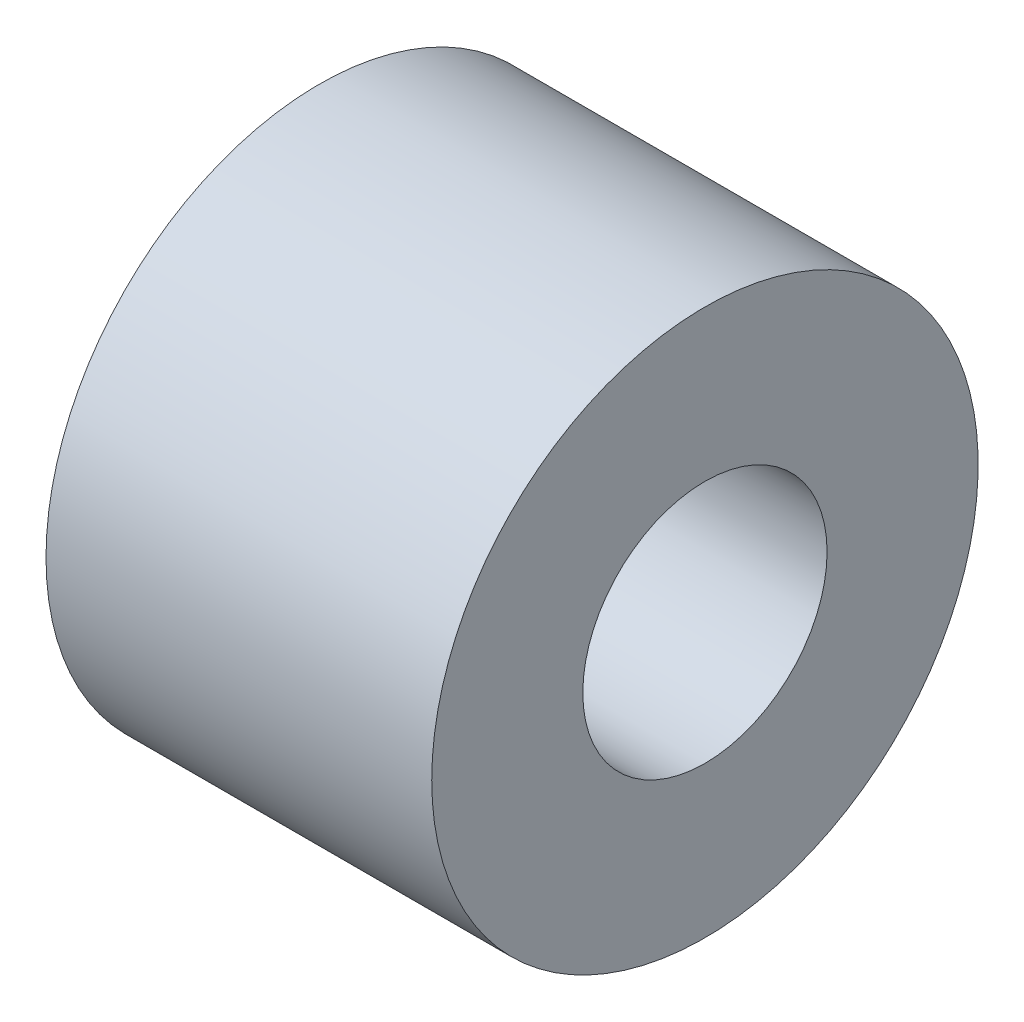
ISO-10303-21;
HEADER;
FILE_DESCRIPTION(('STEP AP214'),'2;1');
FILE_NAME('part.step','',(''),(''),'','','');
FILE_SCHEMA(('AUTOMOTIVE_DESIGN { 1 0 10303 214 1 1 1 1 }'));
ENDSEC;
DATA;
#1=APPLICATION_CONTEXT('core data for automotive mechanical design processes');
#2=APPLICATION_PROTOCOL_DEFINITION('international standard','automotive_design',2000,#1);
#3=PRODUCT_CONTEXT('',#1,'mechanical');
#4=PRODUCT('Part','Part','',(#3));
#5=PRODUCT_RELATED_PRODUCT_CATEGORY('part','',(#4));
#6=PRODUCT_DEFINITION_FORMATION('','',#4);
#7=PRODUCT_DEFINITION_CONTEXT('part definition',#1,'design');
#8=PRODUCT_DEFINITION('design','',#6,#7);
#9=PRODUCT_DEFINITION_SHAPE('','',#8);
#10=(LENGTH_UNIT() NAMED_UNIT(*) SI_UNIT(.MILLI.,.METRE.));
#11=(NAMED_UNIT(*) PLANE_ANGLE_UNIT() SI_UNIT($,.RADIAN.));
#12=(NAMED_UNIT(*) SI_UNIT($,.STERADIAN.) SOLID_ANGLE_UNIT());
#13=UNCERTAINTY_MEASURE_WITH_UNIT(LENGTH_MEASURE(1.E-05),#10,'distance_accuracy_value','');
#14=(GEOMETRIC_REPRESENTATION_CONTEXT(3) GLOBAL_UNCERTAINTY_ASSIGNED_CONTEXT((#13)) GLOBAL_UNIT_ASSIGNED_CONTEXT((#10,
#11,#12)) REPRESENTATION_CONTEXT('',''));
#15=CARTESIAN_POINT('',(0.,0.,0.));
#16=DIRECTION('',(0.,0.,1.));
#17=DIRECTION('',(1.,0.,0.));
#18=AXIS2_PLACEMENT_3D('',#15,#16,#17);
#19=CARTESIAN_POINT('',(3.81,0.,0.));
#20=DIRECTION('',(1.,0.,0.));
#21=DIRECTION('',(0.,0.,-1.00000000000002));
#22=AXIS2_PLACEMENT_3D('',#19,#20,#21);
#23=PLANE('',#22);
#24=CARTESIAN_POINT('',(3.81,0.,0.));
#25=DIRECTION('',(1.,0.,0.));
#26=DIRECTION('',(0.,0.,-1.00000000000002));
#27=AXIS2_PLACEMENT_3D('',#24,#25,#26);
#28=CIRCLE('',#27,5.3975);
#29=CARTESIAN_POINT('',(3.81,0.,5.39750000000009));
#30=VERTEX_POINT('',#29);
#31=EDGE_CURVE('E10',#30,#30,#28,.T.);
#32=ORIENTED_EDGE('',*,*,#31,.T.);
#33=EDGE_LOOP('',(#32));
#34=FACE_BOUND('',#33,.T.);
#35=CARTESIAN_POINT('',(3.81,0.,0.));
#36=DIRECTION('',(1.,0.,0.));
#37=DIRECTION('',(0.,0.,-1.00000000000002));
#38=AXIS2_PLACEMENT_3D('',#35,#36,#37);
#39=CIRCLE('',#38,2.413);
#40=CARTESIAN_POINT('',(3.81,0.,2.41300000000004));
#41=VERTEX_POINT('',#40);
#42=EDGE_CURVE('E43',#41,#41,#39,.T.);
#43=ORIENTED_EDGE('',*,*,#42,.F.);
#44=EDGE_LOOP('',(#43));
#45=FACE_BOUND('',#44,.T.);
#46=ADVANCED_FACE('F32',(#34,#45),#23,.T.);
#47=CARTESIAN_POINT('',(-3.81,0.,0.));
#48=DIRECTION('',(1.,0.,0.));
#49=DIRECTION('',(0.,0.,-1.00000000000002));
#50=AXIS2_PLACEMENT_3D('',#47,#48,#49);
#51=PLANE('',#50);
#52=CARTESIAN_POINT('',(-3.81,0.,0.));
#53=DIRECTION('',(1.,0.,0.));
#54=DIRECTION('',(0.,0.,-1.00000000000002));
#55=AXIS2_PLACEMENT_3D('',#52,#53,#54);
#56=CIRCLE('',#55,5.3975);
#57=CARTESIAN_POINT('',(-3.81,0.,5.39750000000009));
#58=VERTEX_POINT('',#57);
#59=EDGE_CURVE('E36',#58,#58,#56,.T.);
#60=ORIENTED_EDGE('',*,*,#59,.F.);
#61=EDGE_LOOP('',(#60));
#62=FACE_BOUND('',#61,.T.);
#63=CARTESIAN_POINT('',(-3.81,0.,0.));
#64=DIRECTION('',(1.,0.,0.));
#65=DIRECTION('',(0.,0.,-1.00000000000002));
#66=AXIS2_PLACEMENT_3D('',#63,#64,#65);
#67=CIRCLE('',#66,2.413);
#68=CARTESIAN_POINT('',(-3.81,0.,2.41300000000004));
#69=VERTEX_POINT('',#68);
#70=EDGE_CURVE('E45',#69,#69,#67,.T.);
#71=ORIENTED_EDGE('',*,*,#70,.T.);
#72=EDGE_LOOP('',(#71));
#73=FACE_BOUND('',#72,.T.);
#74=ADVANCED_FACE('F55',(#62,#73),#51,.F.);
#75=CARTESIAN_POINT('',(3.81,0.,0.));
#76=DIRECTION('',(-1.,0.,0.));
#77=DIRECTION('',(0.,0.,1.00000000000002));
#78=AXIS2_PLACEMENT_3D('',#75,#76,#77);
#79=CYLINDRICAL_SURFACE('',#78,5.3975);
#80=CARTESIAN_POINT('',(3.81,0.,5.39750000000009));
#81=CARTESIAN_POINT('',(3.730625,0.,5.39750000000009));
#82=CARTESIAN_POINT('',(3.65125,0.,5.39750000000009));
#83=CARTESIAN_POINT('',(3.4925,0.,5.39750000000009));
#84=CARTESIAN_POINT('',(3.413125,0.,5.39750000000009));
#85=CARTESIAN_POINT('',(3.254375,0.,5.39750000000009));
#86=CARTESIAN_POINT('',(3.175,0.,5.39750000000009));
#87=CARTESIAN_POINT('',(3.01625,0.,5.39750000000009));
#88=CARTESIAN_POINT('',(2.936875,0.,5.39750000000009));
#89=CARTESIAN_POINT('',(2.778125,0.,5.39750000000009));
#90=CARTESIAN_POINT('',(2.69875,0.,5.39750000000009));
#91=CARTESIAN_POINT('',(2.54,0.,5.39750000000009));
#92=CARTESIAN_POINT('',(2.460625,0.,5.39750000000009));
#93=CARTESIAN_POINT('',(2.301875,0.,5.39750000000009));
#94=CARTESIAN_POINT('',(2.2225,0.,5.39750000000009));
#95=CARTESIAN_POINT('',(2.06375,0.,5.39750000000009));
#96=CARTESIAN_POINT('',(1.984375,0.,5.39750000000009));
#97=CARTESIAN_POINT('',(1.825625,0.,5.39750000000009));
#98=CARTESIAN_POINT('',(1.74625,0.,5.39750000000009));
#99=CARTESIAN_POINT('',(1.5875,0.,5.39750000000009));
#100=CARTESIAN_POINT('',(1.508125,0.,5.39750000000009));
#101=CARTESIAN_POINT('',(1.349375,0.,5.39750000000009));
#102=CARTESIAN_POINT('',(1.27,0.,5.39750000000009));
#103=CARTESIAN_POINT('',(1.11125,0.,5.39750000000009));
#104=CARTESIAN_POINT('',(1.031875,0.,5.39750000000009));
#105=CARTESIAN_POINT('',(0.873125000000001,0.,5.39750000000009));
#106=CARTESIAN_POINT('',(0.793750000000001,0.,5.39750000000009));
#107=CARTESIAN_POINT('',(0.635000000000001,0.,5.39750000000009));
#108=CARTESIAN_POINT('',(0.555625000000001,0.,5.39750000000009));
#109=CARTESIAN_POINT('',(0.396875000000001,0.,5.39750000000009));
#110=CARTESIAN_POINT('',(0.317500000000001,0.,5.39750000000009));
#111=CARTESIAN_POINT('',(0.15875,0.,5.39750000000009));
#112=CARTESIAN_POINT('',(0.0793750000000002,0.,5.39750000000009));
#113=CARTESIAN_POINT('',(-0.0793749999999999,0.,5.39750000000009));
#114=CARTESIAN_POINT('',(-0.15875,0.,5.39750000000009));
#115=CARTESIAN_POINT('',(-0.3175,0.,5.39750000000009));
#116=CARTESIAN_POINT('',(-0.396875,0.,5.39750000000009));
#117=CARTESIAN_POINT('',(-0.555625,0.,5.39750000000009));
#118=CARTESIAN_POINT('',(-0.635,0.,5.39750000000009));
#119=CARTESIAN_POINT('',(-0.79375,0.,5.39750000000009));
#120=CARTESIAN_POINT('',(-0.873125,0.,5.39750000000009));
#121=CARTESIAN_POINT('',(-1.031875,0.,5.39750000000009));
#122=CARTESIAN_POINT('',(-1.11125,0.,5.39750000000009));
#123=CARTESIAN_POINT('',(-1.27,0.,5.39750000000009));
#124=CARTESIAN_POINT('',(-1.349375,0.,5.39750000000009));
#125=CARTESIAN_POINT('',(-1.508125,0.,5.39750000000009));
#126=CARTESIAN_POINT('',(-1.5875,0.,5.39750000000009));
#127=CARTESIAN_POINT('',(-1.74625,0.,5.39750000000009));
#128=CARTESIAN_POINT('',(-1.825625,0.,5.39750000000009));
#129=CARTESIAN_POINT('',(-1.984375,0.,5.39750000000009));
#130=CARTESIAN_POINT('',(-2.06375,0.,5.39750000000009));
#131=CARTESIAN_POINT('',(-2.2225,0.,5.39750000000009));
#132=CARTESIAN_POINT('',(-2.301875,0.,5.39750000000009));
#133=CARTESIAN_POINT('',(-2.460625,0.,5.39750000000009));
#134=CARTESIAN_POINT('',(-2.54,0.,5.39750000000009));
#135=CARTESIAN_POINT('',(-2.69875,0.,5.39750000000009));
#136=CARTESIAN_POINT('',(-2.778125,0.,5.39750000000009));
#137=CARTESIAN_POINT('',(-2.936875,0.,5.39750000000009));
#138=CARTESIAN_POINT('',(-3.01625,0.,5.39750000000009));
#139=CARTESIAN_POINT('',(-3.175,0.,5.39750000000009));
#140=CARTESIAN_POINT('',(-3.254375,0.,5.39750000000009));
#141=CARTESIAN_POINT('',(-3.413125,0.,5.39750000000009));
#142=CARTESIAN_POINT('',(-3.4925,0.,5.39750000000009));
#143=CARTESIAN_POINT('',(-3.65125,0.,5.39750000000009));
#144=CARTESIAN_POINT('',(-3.730625,0.,5.39750000000009));
#145=CARTESIAN_POINT('',(-3.81,0.,5.39750000000009));
#146=B_SPLINE_CURVE_WITH_KNOTS('',3,(#80,#81,#82,#83,#84,#85,#86,#87,#88,#89,#90,#91,#92,#93,
#94,#95,#96,#97,#98,#99,#100,#101,#102,#103,#104,#105,#106,#107,#108,#109,#110,#111,#112,#113,
#114,#115,#116,#117,#118,#119,#120,#121,#122,#123,#124,#125,#126,#127,#128,#129,#130,#131,#132,
#133,#134,#135,#136,#137,#138,#139,#140,#141,#142,#143,#144,#145),.UNSPECIFIED.,.F.,.F.,(4,2,2,
2,2,2,2,2,2,2,2,2,2,2,2,2,2,2,2,2,2,2,2,2,2,2,2,2,2,2,2,2,4),(0.,0.238125,0.47625,
0.714375000000001,0.952500000000001,1.190625,1.42875,1.666875,1.905,2.143125,2.38125,2.619375,
2.8575,3.095625,3.33375,3.571875,3.81,4.048125,4.28625,4.524375,4.7625,5.000625,5.23875,
5.476875,5.71500000000001,5.95312500000001,6.19125000000001,6.42937500000001,6.66750000000001,
6.90562500000001,7.14375000000001,7.38187500000001,7.62000000000001),.UNSPECIFIED.);
#147=EDGE_CURVE('BSEAM34',#30,#58,#146,.T.);
#148=ORIENTED_EDGE('',*,*,#31,.F.);
#149=ORIENTED_EDGE('',*,*,#59,.T.);
#150=ORIENTED_EDGE('',*,*,#147,.T.);
#151=ORIENTED_EDGE('',*,*,#147,.F.);
#152=EDGE_LOOP('',(#148,#150,#149,#151));
#153=FACE_BOUND('',#152,.T.);
#154=ADVANCED_FACE('F34',(#153),#79,.T.);
#155=CARTESIAN_POINT('',(3.81,0.,0.));
#156=DIRECTION('',(-1.,0.,0.));
#157=DIRECTION('',(0.,0.,1.00000000000002));
#158=AXIS2_PLACEMENT_3D('',#155,#156,#157);
#159=CYLINDRICAL_SURFACE('',#158,2.413);
#160=CARTESIAN_POINT('',(3.81,0.,2.41300000000004));
#161=CARTESIAN_POINT('',(3.730625,0.,2.41300000000004));
#162=CARTESIAN_POINT('',(3.65125,0.,2.41300000000004));
#163=CARTESIAN_POINT('',(3.4925,0.,2.41300000000004));
#164=CARTESIAN_POINT('',(3.413125,0.,2.41300000000004));
#165=CARTESIAN_POINT('',(3.254375,0.,2.41300000000004));
#166=CARTESIAN_POINT('',(3.175,0.,2.41300000000004));
#167=CARTESIAN_POINT('',(3.01625,0.,2.41300000000004));
#168=CARTESIAN_POINT('',(2.936875,0.,2.41300000000004));
#169=CARTESIAN_POINT('',(2.778125,0.,2.41300000000004));
#170=CARTESIAN_POINT('',(2.69875,0.,2.41300000000004));
#171=CARTESIAN_POINT('',(2.54,0.,2.41300000000004));
#172=CARTESIAN_POINT('',(2.460625,0.,2.41300000000004));
#173=CARTESIAN_POINT('',(2.301875,0.,2.41300000000004));
#174=CARTESIAN_POINT('',(2.2225,0.,2.41300000000004));
#175=CARTESIAN_POINT('',(2.06375,0.,2.41300000000004));
#176=CARTESIAN_POINT('',(1.984375,0.,2.41300000000004));
#177=CARTESIAN_POINT('',(1.825625,0.,2.41300000000004));
#178=CARTESIAN_POINT('',(1.74625,0.,2.41300000000004));
#179=CARTESIAN_POINT('',(1.5875,0.,2.41300000000004));
#180=CARTESIAN_POINT('',(1.508125,0.,2.41300000000004));
#181=CARTESIAN_POINT('',(1.349375,0.,2.41300000000004));
#182=CARTESIAN_POINT('',(1.27,0.,2.41300000000004));
#183=CARTESIAN_POINT('',(1.11125,0.,2.41300000000004));
#184=CARTESIAN_POINT('',(1.031875,0.,2.41300000000004));
#185=CARTESIAN_POINT('',(0.873125000000001,0.,2.41300000000004));
#186=CARTESIAN_POINT('',(0.793750000000001,0.,2.41300000000004));
#187=CARTESIAN_POINT('',(0.635000000000001,0.,2.41300000000004));
#188=CARTESIAN_POINT('',(0.555625000000001,0.,2.41300000000004));
#189=CARTESIAN_POINT('',(0.396875000000001,0.,2.41300000000004));
#190=CARTESIAN_POINT('',(0.317500000000001,0.,2.41300000000004));
#191=CARTESIAN_POINT('',(0.15875,0.,2.41300000000004));
#192=CARTESIAN_POINT('',(0.0793750000000002,0.,2.41300000000004));
#193=CARTESIAN_POINT('',(-0.0793749999999999,0.,2.41300000000004));
#194=CARTESIAN_POINT('',(-0.15875,0.,2.41300000000004));
#195=CARTESIAN_POINT('',(-0.3175,0.,2.41300000000004));
#196=CARTESIAN_POINT('',(-0.396875,0.,2.41300000000004));
#197=CARTESIAN_POINT('',(-0.555625,0.,2.41300000000004));
#198=CARTESIAN_POINT('',(-0.635,0.,2.41300000000004));
#199=CARTESIAN_POINT('',(-0.79375,0.,2.41300000000004));
#200=CARTESIAN_POINT('',(-0.873125,0.,2.41300000000004));
#201=CARTESIAN_POINT('',(-1.031875,0.,2.41300000000004));
#202=CARTESIAN_POINT('',(-1.11125,0.,2.41300000000004));
#203=CARTESIAN_POINT('',(-1.27,0.,2.41300000000004));
#204=CARTESIAN_POINT('',(-1.349375,0.,2.41300000000004));
#205=CARTESIAN_POINT('',(-1.508125,0.,2.41300000000004));
#206=CARTESIAN_POINT('',(-1.5875,0.,2.41300000000004));
#207=CARTESIAN_POINT('',(-1.74625,0.,2.41300000000004));
#208=CARTESIAN_POINT('',(-1.825625,0.,2.41300000000004));
#209=CARTESIAN_POINT('',(-1.984375,0.,2.41300000000004));
#210=CARTESIAN_POINT('',(-2.06375,0.,2.41300000000004));
#211=CARTESIAN_POINT('',(-2.2225,0.,2.41300000000004));
#212=CARTESIAN_POINT('',(-2.301875,0.,2.41300000000004));
#213=CARTESIAN_POINT('',(-2.460625,0.,2.41300000000004));
#214=CARTESIAN_POINT('',(-2.54,0.,2.41300000000004));
#215=CARTESIAN_POINT('',(-2.69875,0.,2.41300000000004));
#216=CARTESIAN_POINT('',(-2.778125,0.,2.41300000000004));
#217=CARTESIAN_POINT('',(-2.936875,0.,2.41300000000004));
#218=CARTESIAN_POINT('',(-3.01625,0.,2.41300000000004));
#219=CARTESIAN_POINT('',(-3.175,0.,2.41300000000004));
#220=CARTESIAN_POINT('',(-3.254375,0.,2.41300000000004));
#221=CARTESIAN_POINT('',(-3.413125,0.,2.41300000000004));
#222=CARTESIAN_POINT('',(-3.4925,0.,2.41300000000004));
#223=CARTESIAN_POINT('',(-3.65125,0.,2.41300000000004));
#224=CARTESIAN_POINT('',(-3.730625,0.,2.41300000000004));
#225=CARTESIAN_POINT('',(-3.81,0.,2.41300000000004));
#226=B_SPLINE_CURVE_WITH_KNOTS('',3,(#160,#161,#162,#163,#164,#165,#166,#167,#168,#169,#170,
#171,#172,#173,#174,#175,#176,#177,#178,#179,#180,#181,#182,#183,#184,#185,#186,#187,#188,#189,
#190,#191,#192,#193,#194,#195,#196,#197,#198,#199,#200,#201,#202,#203,#204,#205,#206,#207,#208,
#209,#210,#211,#212,#213,#214,#215,#216,#217,#218,#219,#220,#221,#222,#223,#224,#225),
.UNSPECIFIED.,.F.,.F.,(4,2,2,2,2,2,2,2,2,2,2,2,2,2,2,2,2,2,2,2,2,2,2,2,2,2,2,2,2,2,2,2,4),(0.,
0.238125,0.47625,0.714375000000001,0.952500000000001,1.190625,1.42875,1.666875,1.905,2.143125,
2.38125,2.619375,2.8575,3.095625,3.33375,3.571875,3.81,4.048125,4.28625,4.524375,4.7625,
5.000625,5.23875,5.476875,5.71500000000001,5.95312500000001,6.19125000000001,6.42937500000001,
6.66750000000001,6.90562500000001,7.14375000000001,7.38187500000001,7.62000000000001),.UNSPECIFIED.);
#227=EDGE_CURVE('BSEAM51',#41,#69,#226,.T.);
#228=ORIENTED_EDGE('',*,*,#42,.T.);
#229=ORIENTED_EDGE('',*,*,#70,.F.);
#230=ORIENTED_EDGE('',*,*,#227,.T.);
#231=ORIENTED_EDGE('',*,*,#227,.F.);
#232=EDGE_LOOP('',(#228,#230,#229,#231));
#233=FACE_BOUND('',#232,.T.);
#234=ADVANCED_FACE('F51',(#233),#159,.F.);
#235=CLOSED_SHELL('',(#46,#74,#154,#234));
#236=MANIFOLD_SOLID_BREP('B2',#235);
#237=ADVANCED_BREP_SHAPE_REPRESENTATION('',(#18,#236),#14);
#238=SHAPE_DEFINITION_REPRESENTATION(#9,#237);
ENDSEC;
END-ISO-10303-21;
